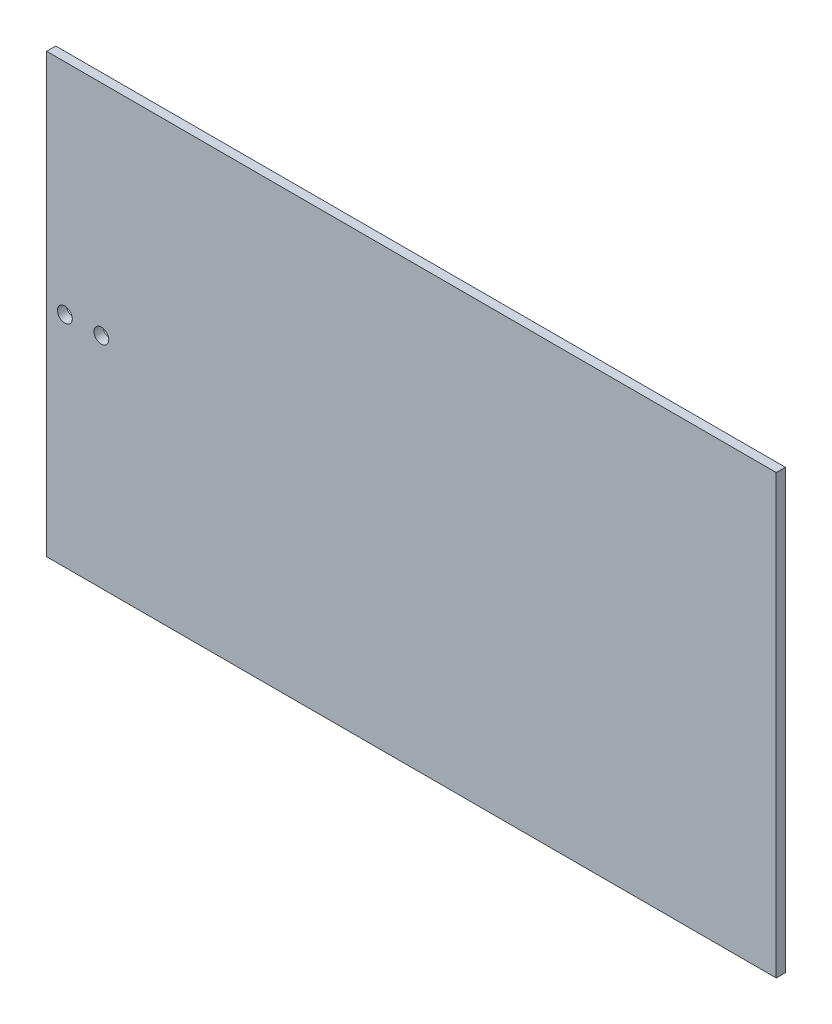
ISO-10303-21;
HEADER;
FILE_DESCRIPTION(('STEP AP214'),'2;1');
FILE_NAME('part.step','',(''),(''),'','','');
FILE_SCHEMA(('AUTOMOTIVE_DESIGN { 1 0 10303 214 1 1 1 1 }'));
ENDSEC;
DATA;
#1=APPLICATION_CONTEXT('core data for automotive mechanical design processes');
#2=APPLICATION_PROTOCOL_DEFINITION('international standard','automotive_design',2000,#1);
#3=PRODUCT_CONTEXT('',#1,'mechanical');
#4=PRODUCT('Part','Part','',(#3));
#5=PRODUCT_RELATED_PRODUCT_CATEGORY('part','',(#4));
#6=PRODUCT_DEFINITION_FORMATION('','',#4);
#7=PRODUCT_DEFINITION_CONTEXT('part definition',#1,'design');
#8=PRODUCT_DEFINITION('design','',#6,#7);
#9=PRODUCT_DEFINITION_SHAPE('','',#8);
#10=(LENGTH_UNIT() NAMED_UNIT(*) SI_UNIT(.MILLI.,.METRE.));
#11=(NAMED_UNIT(*) PLANE_ANGLE_UNIT() SI_UNIT($,.RADIAN.));
#12=(NAMED_UNIT(*) SI_UNIT($,.STERADIAN.) SOLID_ANGLE_UNIT());
#13=UNCERTAINTY_MEASURE_WITH_UNIT(LENGTH_MEASURE(1.E-05),#10,'distance_accuracy_value','');
#14=(GEOMETRIC_REPRESENTATION_CONTEXT(3) GLOBAL_UNCERTAINTY_ASSIGNED_CONTEXT((#13)) GLOBAL_UNIT_ASSIGNED_CONTEXT((#10,
#11,#12)) REPRESENTATION_CONTEXT('',''));
#15=CARTESIAN_POINT('',(0.,0.,0.));
#16=DIRECTION('',(0.,0.,1.));
#17=DIRECTION('',(1.,0.,0.));
#18=AXIS2_PLACEMENT_3D('',#15,#16,#17);
#19=CARTESIAN_POINT('',(-158.86542567821,64.9705263157895,3.175));
#20=DIRECTION('',(1.,0.,0.));
#21=DIRECTION('',(0.,0.,-1.));
#22=AXIS2_PLACEMENT_3D('',#19,#20,#21);
#23=PLANE('',#22);
#24=DIRECTION('',(0.,-1.,0.));
#25=VECTOR('',#24,1.);
#26=CARTESIAN_POINT('',(-158.86542567821,64.9705263157895,0.));
#27=LINE('',#26,#25);
#28=CARTESIAN_POINT('',(-158.86542567821,64.9705263157895,0.));
#29=VERTEX_POINT('',#28);
#30=CARTESIAN_POINT('',(-158.86542567821,-87.4294736842105,0.));
#31=VERTEX_POINT('',#30);
#32=EDGE_CURVE('E107',#29,#31,#27,.T.);
#33=ORIENTED_EDGE('',*,*,#32,.T.);
#34=DIRECTION('',(0.,0.,-1.));
#35=VECTOR('',#34,1.);
#36=CARTESIAN_POINT('',(-158.86542567821,-87.4294736842105,3.175));
#37=LINE('',#36,#35);
#38=CARTESIAN_POINT('',(-158.86542567821,-87.4294736842105,3.175));
#39=VERTEX_POINT('',#38);
#40=EDGE_CURVE('E11',#39,#31,#37,.T.);
#41=ORIENTED_EDGE('',*,*,#40,.F.);
#42=DIRECTION('',(0.,-1.,0.));
#43=VECTOR('',#42,1.);
#44=CARTESIAN_POINT('',(-158.86542567821,64.9705263157895,3.175));
#45=LINE('',#44,#43);
#46=CARTESIAN_POINT('',(-158.86542567821,64.9705263157895,3.175));
#47=VERTEX_POINT('',#46);
#48=EDGE_CURVE('E91',#47,#39,#45,.T.);
#49=ORIENTED_EDGE('',*,*,#48,.F.);
#50=DIRECTION('',(0.,0.,-1.));
#51=VECTOR('',#50,1.);
#52=CARTESIAN_POINT('',(-158.86542567821,64.9705263157895,3.175));
#53=LINE('',#52,#51);
#54=EDGE_CURVE('E103',#47,#29,#53,.T.);
#55=ORIENTED_EDGE('',*,*,#54,.T.);
#56=EDGE_LOOP('',(#33,#41,#49,#55));
#57=FACE_BOUND('',#56,.T.);
#58=ADVANCED_FACE('F39',(#57),#23,.F.);
#59=CARTESIAN_POINT('',(-158.86542567821,-87.4294736842105,3.175));
#60=DIRECTION('',(0.,1.,0.));
#61=DIRECTION('',(-1.,0.,0.));
#62=AXIS2_PLACEMENT_3D('',#59,#60,#61);
#63=PLANE('',#62);
#64=DIRECTION('',(1.,0.,0.));
#65=VECTOR('',#64,1.);
#66=CARTESIAN_POINT('',(-158.86542567821,-87.4294736842105,0.));
#67=LINE('',#66,#65);
#68=CARTESIAN_POINT('',(95.1345743217903,-87.4294736842105,0.));
#69=VERTEX_POINT('',#68);
#70=EDGE_CURVE('E96',#31,#69,#67,.T.);
#71=ORIENTED_EDGE('',*,*,#70,.T.);
#72=DIRECTION('',(0.,0.,-1.));
#73=VECTOR('',#72,1.);
#74=CARTESIAN_POINT('',(95.1345743217903,-87.4294736842105,3.175));
#75=LINE('',#74,#73);
#76=CARTESIAN_POINT('',(95.1345743217903,-87.4294736842105,3.175));
#77=VERTEX_POINT('',#76);
#78=EDGE_CURVE('E48',#77,#69,#75,.T.);
#79=ORIENTED_EDGE('',*,*,#78,.F.);
#80=DIRECTION('',(1.,0.,0.));
#81=VECTOR('',#80,1.);
#82=CARTESIAN_POINT('',(-158.86542567821,-87.4294736842105,3.175));
#83=LINE('',#82,#81);
#84=EDGE_CURVE('E86',#39,#77,#83,.T.);
#85=ORIENTED_EDGE('',*,*,#84,.F.);
#86=ORIENTED_EDGE('',*,*,#40,.T.);
#87=EDGE_LOOP('',(#71,#79,#85,#86));
#88=FACE_BOUND('',#87,.T.);
#89=ADVANCED_FACE('F95',(#88),#63,.F.);
#90=CARTESIAN_POINT('',(95.1345743217903,64.9705263157895,3.175));
#91=DIRECTION('',(-1.,0.,0.));
#92=DIRECTION('',(0.,0.,1.));
#93=AXIS2_PLACEMENT_3D('',#90,#91,#92);
#94=PLANE('',#93);
#95=DIRECTION('',(0.,1.,0.));
#96=VECTOR('',#95,1.);
#97=CARTESIAN_POINT('',(95.1345743217903,64.9705263157895,0.));
#98=LINE('',#97,#96);
#99=CARTESIAN_POINT('',(95.1345743217903,64.9705263157895,0.));
#100=VERTEX_POINT('',#99);
#101=EDGE_CURVE('E73',#69,#100,#98,.T.);
#102=ORIENTED_EDGE('',*,*,#101,.T.);
#103=DIRECTION('',(0.,0.,-1.));
#104=VECTOR('',#103,1.);
#105=CARTESIAN_POINT('',(95.1345743217903,64.9705263157895,3.175));
#106=LINE('',#105,#104);
#107=CARTESIAN_POINT('',(95.1345743217903,64.9705263157895,3.175));
#108=VERTEX_POINT('',#107);
#109=EDGE_CURVE('E98',#108,#100,#106,.T.);
#110=ORIENTED_EDGE('',*,*,#109,.F.);
#111=DIRECTION('',(0.,1.,0.));
#112=VECTOR('',#111,1.);
#113=CARTESIAN_POINT('',(95.1345743217903,64.9705263157895,3.175));
#114=LINE('',#113,#112);
#115=EDGE_CURVE('E89',#77,#108,#114,.T.);
#116=ORIENTED_EDGE('',*,*,#115,.F.);
#117=ORIENTED_EDGE('',*,*,#78,.T.);
#118=EDGE_LOOP('',(#102,#110,#116,#117));
#119=FACE_BOUND('',#118,.T.);
#120=ADVANCED_FACE('F99',(#119),#94,.F.);
#121=CARTESIAN_POINT('',(-158.86542567821,64.9705263157895,3.175));
#122=DIRECTION('',(0.,-1.,0.));
#123=DIRECTION('',(0.,0.,-1.));
#124=AXIS2_PLACEMENT_3D('',#121,#122,#123);
#125=PLANE('',#124);
#126=DIRECTION('',(-1.,0.,0.));
#127=VECTOR('',#126,1.);
#128=CARTESIAN_POINT('',(-158.86542567821,64.9705263157895,0.));
#129=LINE('',#128,#127);
#130=EDGE_CURVE('E79',#100,#29,#129,.T.);
#131=ORIENTED_EDGE('',*,*,#130,.T.);
#132=ORIENTED_EDGE('',*,*,#54,.F.);
#133=DIRECTION('',(-1.,0.,0.));
#134=VECTOR('',#133,1.);
#135=CARTESIAN_POINT('',(-158.86542567821,64.9705263157895,3.175));
#136=LINE('',#135,#134);
#137=EDGE_CURVE('E56',#108,#47,#136,.T.);
#138=ORIENTED_EDGE('',*,*,#137,.F.);
#139=ORIENTED_EDGE('',*,*,#109,.T.);
#140=EDGE_LOOP('',(#131,#132,#138,#139));
#141=FACE_BOUND('',#140,.T.);
#142=ADVANCED_FACE('F121',(#141),#125,.F.);
#143=CARTESIAN_POINT('',(0.,0.,3.175));
#144=DIRECTION('',(0.,0.,1.));
#145=DIRECTION('',(1.,0.,0.));
#146=AXIS2_PLACEMENT_3D('',#143,#144,#145);
#147=PLANE('',#146);
#148=CARTESIAN_POINT('',(-152.51542567821,-11.2294736842105,3.175));
#149=DIRECTION('',(0.,0.,1.));
#150=DIRECTION('',(1.,0.,0.));
#151=AXIS2_PLACEMENT_3D('',#148,#149,#150);
#152=CIRCLE('',#151,2.57968750000001);
#153=CARTESIAN_POINT('',(-149.93573817821,-11.2294736842105,3.175));
#154=VERTEX_POINT('',#153);
#155=EDGE_CURVE('E136',#154,#154,#152,.T.);
#156=ORIENTED_EDGE('',*,*,#155,.F.);
#157=EDGE_LOOP('',(#156));
#158=FACE_BOUND('',#157,.T.);
#159=CARTESIAN_POINT('',(-139.81542567821,-11.2294736842105,3.175));
#160=DIRECTION('',(0.,0.,1.));
#161=DIRECTION('',(1.,0.,0.));
#162=AXIS2_PLACEMENT_3D('',#159,#160,#161);
#163=CIRCLE('',#162,2.57968750000001);
#164=CARTESIAN_POINT('',(-137.23573817821,-11.2294736842105,3.175));
#165=VERTEX_POINT('',#164);
#166=EDGE_CURVE('E128',#165,#165,#163,.T.);
#167=ORIENTED_EDGE('',*,*,#166,.F.);
#168=EDGE_LOOP('',(#167));
#169=FACE_BOUND('',#168,.T.);
#170=ORIENTED_EDGE('',*,*,#48,.T.);
#171=ORIENTED_EDGE('',*,*,#84,.T.);
#172=ORIENTED_EDGE('',*,*,#115,.T.);
#173=ORIENTED_EDGE('',*,*,#137,.T.);
#174=EDGE_LOOP('',(#170,#171,#172,#173));
#175=FACE_BOUND('',#174,.T.);
#176=ADVANCED_FACE('F87',(#158,#169,#175),#147,.T.);
#177=CARTESIAN_POINT('',(0.,0.,0.));
#178=DIRECTION('',(0.,0.,1.));
#179=DIRECTION('',(1.,0.,0.));
#180=AXIS2_PLACEMENT_3D('',#177,#178,#179);
#181=PLANE('',#180);
#182=CARTESIAN_POINT('',(-152.51542567821,-11.2294736842105,0.));
#183=DIRECTION('',(0.,0.,1.));
#184=DIRECTION('',(1.,0.,0.));
#185=AXIS2_PLACEMENT_3D('',#182,#183,#184);
#186=CIRCLE('',#185,2.57968750000001);
#187=CARTESIAN_POINT('',(-149.93573817821,-11.2294736842105,0.));
#188=VERTEX_POINT('',#187);
#189=EDGE_CURVE('E111',#188,#188,#186,.T.);
#190=ORIENTED_EDGE('',*,*,#189,.T.);
#191=EDGE_LOOP('',(#190));
#192=FACE_BOUND('',#191,.T.);
#193=CARTESIAN_POINT('',(-139.81542567821,-11.2294736842105,0.));
#194=DIRECTION('',(0.,0.,1.));
#195=DIRECTION('',(1.,0.,0.));
#196=AXIS2_PLACEMENT_3D('',#193,#194,#195);
#197=CIRCLE('',#196,2.57968750000001);
#198=CARTESIAN_POINT('',(-137.23573817821,-11.2294736842105,0.));
#199=VERTEX_POINT('',#198);
#200=EDGE_CURVE('E132',#199,#199,#197,.T.);
#201=ORIENTED_EDGE('',*,*,#200,.T.);
#202=EDGE_LOOP('',(#201));
#203=FACE_BOUND('',#202,.T.);
#204=ORIENTED_EDGE('',*,*,#32,.F.);
#205=ORIENTED_EDGE('',*,*,#130,.F.);
#206=ORIENTED_EDGE('',*,*,#101,.F.);
#207=ORIENTED_EDGE('',*,*,#70,.F.);
#208=EDGE_LOOP('',(#204,#205,#206,#207));
#209=FACE_BOUND('',#208,.T.);
#210=ADVANCED_FACE('F124',(#192,#203,#209),#181,.F.);
#211=CARTESIAN_POINT('',(-139.81542567821,-11.2294736842105,0.));
#212=DIRECTION('',(0.,0.,1.));
#213=DIRECTION('',(1.,0.,0.));
#214=AXIS2_PLACEMENT_3D('',#211,#212,#213);
#215=CYLINDRICAL_SURFACE('',#214,2.57968750000001);
#216=ORIENTED_EDGE('',*,*,#200,.F.);
#217=EDGE_LOOP('',(#216));
#218=FACE_BOUND('',#217,.T.);
#219=ORIENTED_EDGE('',*,*,#166,.T.);
#220=EDGE_LOOP('',(#219));
#221=FACE_BOUND('',#220,.T.);
#222=ADVANCED_FACE('F149',(#218,#221),#215,.F.);
#223=CARTESIAN_POINT('',(-152.51542567821,-11.2294736842105,0.));
#224=DIRECTION('',(0.,0.,1.));
#225=DIRECTION('',(1.,0.,0.));
#226=AXIS2_PLACEMENT_3D('',#223,#224,#225);
#227=CYLINDRICAL_SURFACE('',#226,2.57968750000001);
#228=ORIENTED_EDGE('',*,*,#189,.F.);
#229=EDGE_LOOP('',(#228));
#230=FACE_BOUND('',#229,.T.);
#231=ORIENTED_EDGE('',*,*,#155,.T.);
#232=EDGE_LOOP('',(#231));
#233=FACE_BOUND('',#232,.T.);
#234=ADVANCED_FACE('F146',(#230,#233),#227,.F.);
#235=CLOSED_SHELL('',(#58,#89,#120,#142,#176,#210,#222,#234));
#236=MANIFOLD_SOLID_BREP('B2',#235);
#237=ADVANCED_BREP_SHAPE_REPRESENTATION('',(#18,#236),#14);
#238=SHAPE_DEFINITION_REPRESENTATION(#9,#237);
ENDSEC;
END-ISO-10303-21;
